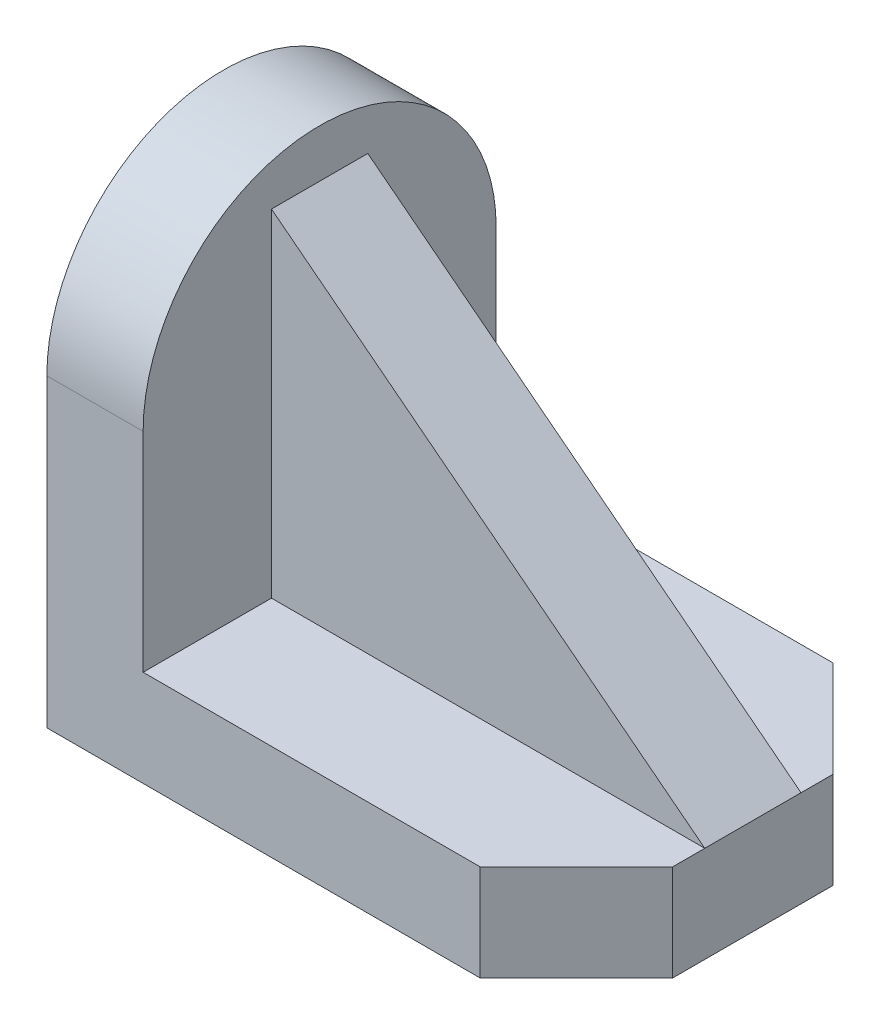
ISO-10303-21;
HEADER;
FILE_DESCRIPTION(('STEP AP214'),'2;1');
FILE_NAME('part.step','',(''),(''),'','','');
FILE_SCHEMA(('AUTOMOTIVE_DESIGN { 1 0 10303 214 1 1 1 1 }'));
ENDSEC;
DATA;
#1=APPLICATION_CONTEXT('core data for automotive mechanical design processes');
#2=APPLICATION_PROTOCOL_DEFINITION('international standard','automotive_design',2000,#1);
#3=PRODUCT_CONTEXT('',#1,'mechanical');
#4=PRODUCT('Part','Part','',(#3));
#5=PRODUCT_RELATED_PRODUCT_CATEGORY('part','',(#4));
#6=PRODUCT_DEFINITION_FORMATION('','',#4);
#7=PRODUCT_DEFINITION_CONTEXT('part definition',#1,'design');
#8=PRODUCT_DEFINITION('design','',#6,#7);
#9=PRODUCT_DEFINITION_SHAPE('','',#8);
#10=(LENGTH_UNIT() NAMED_UNIT(*) SI_UNIT(.MILLI.,.METRE.));
#11=(NAMED_UNIT(*) PLANE_ANGLE_UNIT() SI_UNIT($,.RADIAN.));
#12=(NAMED_UNIT(*) SI_UNIT($,.STERADIAN.) SOLID_ANGLE_UNIT());
#13=UNCERTAINTY_MEASURE_WITH_UNIT(LENGTH_MEASURE(1.E-05),#10,'distance_accuracy_value','');
#14=(GEOMETRIC_REPRESENTATION_CONTEXT(3) GLOBAL_UNCERTAINTY_ASSIGNED_CONTEXT((#13)) GLOBAL_UNIT_ASSIGNED_CONTEXT((#10,
#11,#12)) REPRESENTATION_CONTEXT('',''));
#15=CARTESIAN_POINT('',(0.,0.,0.));
#16=DIRECTION('',(0.,0.,1.));
#17=DIRECTION('',(1.,0.,0.));
#18=AXIS2_PLACEMENT_3D('',#15,#16,#17);
#19=CARTESIAN_POINT('',(0.,12.,0.));
#20=DIRECTION('',(0.,-1.,0.));
#21=DIRECTION('',(0.,0.,-1.));
#22=AXIS2_PLACEMENT_3D('',#19,#20,#21);
#23=PLANE('',#22);
#24=DIRECTION('',(1.,0.,0.));
#25=VECTOR('',#24,1.);
#26=CARTESIAN_POINT('',(33.,12.,-6.));
#27=LINE('',#26,#25);
#28=CARTESIAN_POINT('',(-21.,12.,-6.));
#29=VERTEX_POINT('',#28);
#30=CARTESIAN_POINT('',(33.,12.,-6.));
#31=VERTEX_POINT('',#30);
#32=EDGE_CURVE('E57',#29,#31,#27,.T.);
#33=ORIENTED_EDGE('',*,*,#32,.T.);
#34=DIRECTION('',(0.,0.,-1.));
#35=VECTOR('',#34,1.);
#36=CARTESIAN_POINT('',(33.,12.,22.));
#37=LINE('',#36,#35);
#38=CARTESIAN_POINT('',(33.,12.,-9.99999999999994));
#39=VERTEX_POINT('',#38);
#40=EDGE_CURVE('E161',#31,#39,#37,.T.);
#41=ORIENTED_EDGE('',*,*,#40,.T.);
#42=DIRECTION('',(0.707106781186546,0.,0.707106781186549));
#43=VECTOR('',#42,1.);
#44=CARTESIAN_POINT('',(21.,12.,-22.));
#45=LINE('',#44,#43);
#46=CARTESIAN_POINT('',(21.,12.,-22.));
#47=VERTEX_POINT('',#46);
#48=EDGE_CURVE('E196',#39,#47,#45,.F.);
#49=ORIENTED_EDGE('',*,*,#48,.T.);
#50=DIRECTION('',(-1.,0.,0.));
#51=VECTOR('',#50,1.);
#52=CARTESIAN_POINT('',(-33.,12.,-22.));
#53=LINE('',#52,#51);
#54=CARTESIAN_POINT('',(-21.,12.,-22.));
#55=VERTEX_POINT('',#54);
#56=EDGE_CURVE('E160',#47,#55,#53,.T.);
#57=ORIENTED_EDGE('',*,*,#56,.T.);
#58=DIRECTION('',(0.,0.,1.));
#59=VECTOR('',#58,1.);
#60=CARTESIAN_POINT('',(-21.,12.,-22.));
#61=LINE('',#60,#59);
#62=EDGE_CURVE('E149',#55,#29,#61,.T.);
#63=ORIENTED_EDGE('',*,*,#62,.T.);
#64=EDGE_LOOP('',(#33,#41,#49,#57,#63));
#65=FACE_BOUND('',#64,.T.);
#66=ADVANCED_FACE('F41',(#65),#23,.F.);
#67=CARTESIAN_POINT('',(-21.,38.,0.));
#68=DIRECTION('',(-1.,0.,0.));
#69=DIRECTION('',(0.,0.,1.));
#70=AXIS2_PLACEMENT_3D('',#67,#68,#69);
#71=CYLINDRICAL_SURFACE('',#70,22.);
#72=DIRECTION('',(1.,0.,0.));
#73=VECTOR('',#72,1.);
#74=CARTESIAN_POINT('',(-21.,38.,22.));
#75=LINE('',#74,#73);
#76=CARTESIAN_POINT('',(-21.,38.,22.));
#77=VERTEX_POINT('',#76);
#78=CARTESIAN_POINT('',(-33.,38.,22.));
#79=VERTEX_POINT('',#78);
#80=EDGE_CURVE('E201',#77,#79,#75,.F.);
#81=ORIENTED_EDGE('',*,*,#80,.F.);
#82=CARTESIAN_POINT('',(-21.,38.,0.));
#83=DIRECTION('',(1.,0.,0.));
#84=DIRECTION('',(0.,0.,-1.));
#85=AXIS2_PLACEMENT_3D('',#82,#83,#84);
#86=CIRCLE('',#85,22.);
#87=CARTESIAN_POINT('',(-21.,38.,-22.));
#88=VERTEX_POINT('',#87);
#89=EDGE_CURVE('E50',#88,#77,#86,.T.);
#90=ORIENTED_EDGE('',*,*,#89,.F.);
#91=DIRECTION('',(1.,0.,0.));
#92=VECTOR('',#91,1.);
#93=CARTESIAN_POINT('',(-21.,38.,-22.));
#94=LINE('',#93,#92);
#95=CARTESIAN_POINT('',(-33.,38.,-22.));
#96=VERTEX_POINT('',#95);
#97=EDGE_CURVE('E204',#96,#88,#94,.T.);
#98=ORIENTED_EDGE('',*,*,#97,.F.);
#99=CARTESIAN_POINT('',(-33.,38.,0.));
#100=DIRECTION('',(1.,0.,0.));
#101=DIRECTION('',(0.,0.,-1.));
#102=AXIS2_PLACEMENT_3D('',#99,#100,#101);
#103=CIRCLE('',#102,22.);
#104=EDGE_CURVE('E11',#79,#96,#103,.F.);
#105=ORIENTED_EDGE('',*,*,#104,.F.);
#106=EDGE_LOOP('',(#81,#90,#98,#105));
#107=FACE_BOUND('',#106,.T.);
#108=ADVANCED_FACE('F44',(#107),#71,.T.);
#109=CARTESIAN_POINT('',(33.,12.,22.));
#110=DIRECTION('',(-1.,0.,0.));
#111=DIRECTION('',(0.,0.,1.));
#112=AXIS2_PLACEMENT_3D('',#109,#110,#111);
#113=PLANE('',#112);
#114=DIRECTION('',(0.,0.,-1.));
#115=VECTOR('',#114,1.);
#116=CARTESIAN_POINT('',(33.,0.,22.));
#117=LINE('',#116,#115);
#118=CARTESIAN_POINT('',(33.,0.,9.99999999999999));
#119=VERTEX_POINT('',#118);
#120=CARTESIAN_POINT('',(33.,0.,-9.99999999999994));
#121=VERTEX_POINT('',#120);
#122=EDGE_CURVE('E158',#119,#121,#117,.T.);
#123=ORIENTED_EDGE('',*,*,#122,.T.);
#124=DIRECTION('',(0.,1.,0.));
#125=VECTOR('',#124,1.);
#126=CARTESIAN_POINT('',(33.,12.,-9.99999999999994));
#127=LINE('',#126,#125);
#128=EDGE_CURVE('E191',#121,#39,#127,.T.);
#129=ORIENTED_EDGE('',*,*,#128,.T.);
#130=ORIENTED_EDGE('',*,*,#40,.F.);
#131=DIRECTION('',(0.,0.,-1.));
#132=VECTOR('',#131,1.);
#133=CARTESIAN_POINT('',(33.,12.,6.));
#134=LINE('',#133,#132);
#135=CARTESIAN_POINT('',(33.,12.,6.));
#136=VERTEX_POINT('',#135);
#137=EDGE_CURVE('E153',#136,#31,#134,.T.);
#138=ORIENTED_EDGE('',*,*,#137,.F.);
#139=CARTESIAN_POINT('',(33.,12.,9.99999999999999));
#140=VERTEX_POINT('',#139);
#141=EDGE_CURVE('E143',#140,#136,#37,.T.);
#142=ORIENTED_EDGE('',*,*,#141,.F.);
#143=DIRECTION('',(0.,-1.,0.));
#144=VECTOR('',#143,1.);
#145=CARTESIAN_POINT('',(33.,12.,9.99999999999999));
#146=LINE('',#145,#144);
#147=EDGE_CURVE('E188',#140,#119,#146,.T.);
#148=ORIENTED_EDGE('',*,*,#147,.T.);
#149=EDGE_LOOP('',(#123,#129,#130,#138,#142,#148));
#150=FACE_BOUND('',#149,.T.);
#151=ADVANCED_FACE('F216',(#150),#113,.F.);
#152=CARTESIAN_POINT('',(-33.,12.,-22.));
#153=DIRECTION('',(0.,0.,1.));
#154=DIRECTION('',(1.,0.,0.));
#155=AXIS2_PLACEMENT_3D('',#152,#153,#154);
#156=PLANE('',#155);
#157=DIRECTION('',(0.,-1.,0.));
#158=VECTOR('',#157,1.);
#159=CARTESIAN_POINT('',(-33.,12.,-22.));
#160=LINE('',#159,#158);
#161=CARTESIAN_POINT('',(-33.,0.,-22.));
#162=VERTEX_POINT('',#161);
#163=EDGE_CURVE('E179',#96,#162,#160,.T.);
#164=ORIENTED_EDGE('',*,*,#163,.F.);
#165=ORIENTED_EDGE('',*,*,#97,.T.);
#166=DIRECTION('',(0.,-1.,0.));
#167=VECTOR('',#166,1.);
#168=CARTESIAN_POINT('',(-21.,12.,-22.));
#169=LINE('',#168,#167);
#170=EDGE_CURVE('E150',#88,#55,#169,.T.);
#171=ORIENTED_EDGE('',*,*,#170,.T.);
#172=ORIENTED_EDGE('',*,*,#56,.F.);
#173=DIRECTION('',(0.,-1.,0.));
#174=VECTOR('',#173,1.);
#175=CARTESIAN_POINT('',(21.,12.,-22.));
#176=LINE('',#175,#174);
#177=CARTESIAN_POINT('',(21.,0.,-22.));
#178=VERTEX_POINT('',#177);
#179=EDGE_CURVE('E181',#47,#178,#176,.T.);
#180=ORIENTED_EDGE('',*,*,#179,.T.);
#181=DIRECTION('',(-1.,0.,0.));
#182=VECTOR('',#181,1.);
#183=CARTESIAN_POINT('',(-33.,0.,-22.));
#184=LINE('',#183,#182);
#185=EDGE_CURVE('E169',#178,#162,#184,.T.);
#186=ORIENTED_EDGE('',*,*,#185,.T.);
#187=EDGE_LOOP('',(#164,#165,#171,#172,#180,#186));
#188=FACE_BOUND('',#187,.T.);
#189=ADVANCED_FACE('F229',(#188),#156,.F.);
#190=CARTESIAN_POINT('',(-33.,12.,22.));
#191=DIRECTION('',(1.,0.,0.));
#192=DIRECTION('',(0.,0.,-1.));
#193=AXIS2_PLACEMENT_3D('',#190,#191,#192);
#194=PLANE('',#193);
#195=DIRECTION('',(0.,-1.,0.));
#196=VECTOR('',#195,1.);
#197=CARTESIAN_POINT('',(-33.,12.,22.));
#198=LINE('',#197,#196);
#199=CARTESIAN_POINT('',(-33.,0.,22.));
#200=VERTEX_POINT('',#199);
#201=EDGE_CURVE('E166',#79,#200,#198,.T.);
#202=ORIENTED_EDGE('',*,*,#201,.F.);
#203=ORIENTED_EDGE('',*,*,#104,.T.);
#204=ORIENTED_EDGE('',*,*,#163,.T.);
#205=DIRECTION('',(0.,0.,1.));
#206=VECTOR('',#205,1.);
#207=CARTESIAN_POINT('',(-33.,0.,22.));
#208=LINE('',#207,#206);
#209=EDGE_CURVE('E172',#162,#200,#208,.T.);
#210=ORIENTED_EDGE('',*,*,#209,.T.);
#211=EDGE_LOOP('',(#202,#203,#204,#210));
#212=FACE_BOUND('',#211,.T.);
#213=ADVANCED_FACE('F226',(#212),#194,.F.);
#214=CARTESIAN_POINT('',(-33.,12.,22.));
#215=DIRECTION('',(0.,0.,-1.));
#216=DIRECTION('',(-1.,0.,0.));
#217=AXIS2_PLACEMENT_3D('',#214,#215,#216);
#218=PLANE('',#217);
#219=DIRECTION('',(0.,1.,0.));
#220=VECTOR('',#219,1.);
#221=CARTESIAN_POINT('',(-21.,12.,22.));
#222=LINE('',#221,#220);
#223=CARTESIAN_POINT('',(-21.,12.,22.));
#224=VERTEX_POINT('',#223);
#225=EDGE_CURVE('E147',#224,#77,#222,.T.);
#226=ORIENTED_EDGE('',*,*,#225,.T.);
#227=ORIENTED_EDGE('',*,*,#80,.T.);
#228=ORIENTED_EDGE('',*,*,#201,.T.);
#229=DIRECTION('',(1.,0.,0.));
#230=VECTOR('',#229,1.);
#231=CARTESIAN_POINT('',(-33.,0.,22.));
#232=LINE('',#231,#230);
#233=CARTESIAN_POINT('',(21.,0.,22.));
#234=VERTEX_POINT('',#233);
#235=EDGE_CURVE('E175',#200,#234,#232,.T.);
#236=ORIENTED_EDGE('',*,*,#235,.T.);
#237=DIRECTION('',(0.,1.,0.));
#238=VECTOR('',#237,1.);
#239=CARTESIAN_POINT('',(21.,12.,22.));
#240=LINE('',#239,#238);
#241=CARTESIAN_POINT('',(21.,12.,22.));
#242=VERTEX_POINT('',#241);
#243=EDGE_CURVE('E198',#234,#242,#240,.T.);
#244=ORIENTED_EDGE('',*,*,#243,.T.);
#245=DIRECTION('',(1.,0.,0.));
#246=VECTOR('',#245,1.);
#247=CARTESIAN_POINT('',(-33.,12.,22.));
#248=LINE('',#247,#246);
#249=EDGE_CURVE('E164',#224,#242,#248,.T.);
#250=ORIENTED_EDGE('',*,*,#249,.F.);
#251=EDGE_LOOP('',(#226,#227,#228,#236,#244,#250));
#252=FACE_BOUND('',#251,.T.);
#253=ADVANCED_FACE('F209',(#252),#218,.F.);
#254=ORIENTED_EDGE('',*,*,#141,.T.);
#255=DIRECTION('',(1.,0.,0.));
#256=VECTOR('',#255,1.);
#257=CARTESIAN_POINT('',(33.,12.,6.));
#258=LINE('',#257,#256);
#259=CARTESIAN_POINT('',(-21.,12.,6.));
#260=VERTEX_POINT('',#259);
#261=EDGE_CURVE('E128',#260,#136,#258,.T.);
#262=ORIENTED_EDGE('',*,*,#261,.F.);
#263=EDGE_CURVE('E140',#260,#224,#61,.T.);
#264=ORIENTED_EDGE('',*,*,#263,.T.);
#265=ORIENTED_EDGE('',*,*,#249,.T.);
#266=DIRECTION('',(-0.707106781186549,0.,0.707106781186546));
#267=VECTOR('',#266,1.);
#268=CARTESIAN_POINT('',(33.,12.,9.99999999999999));
#269=LINE('',#268,#267);
#270=EDGE_CURVE('E194',#242,#140,#269,.F.);
#271=ORIENTED_EDGE('',*,*,#270,.T.);
#272=EDGE_LOOP('',(#254,#262,#264,#265,#271));
#273=FACE_BOUND('',#272,.T.);
#274=ADVANCED_FACE('F139',(#273),#23,.F.);
#275=CARTESIAN_POINT('',(0.,0.,0.));
#276=DIRECTION('',(0.,-1.,0.));
#277=DIRECTION('',(0.,0.,-1.));
#278=AXIS2_PLACEMENT_3D('',#275,#276,#277);
#279=PLANE('',#278);
#280=ORIENTED_EDGE('',*,*,#185,.F.);
#281=DIRECTION('',(-0.707106781186546,0.,-0.707106781186549));
#282=VECTOR('',#281,1.);
#283=CARTESIAN_POINT('',(21.5,0.,-21.5));
#284=LINE('',#283,#282);
#285=EDGE_CURVE('E186',#178,#121,#284,.F.);
#286=ORIENTED_EDGE('',*,*,#285,.T.);
#287=ORIENTED_EDGE('',*,*,#122,.F.);
#288=DIRECTION('',(0.707106781186549,0.,-0.707106781186546));
#289=VECTOR('',#288,1.);
#290=CARTESIAN_POINT('',(21.4999999999999,0.,21.5));
#291=LINE('',#290,#289);
#292=EDGE_CURVE('E184',#119,#234,#291,.F.);
#293=ORIENTED_EDGE('',*,*,#292,.T.);
#294=ORIENTED_EDGE('',*,*,#235,.F.);
#295=ORIENTED_EDGE('',*,*,#209,.F.);
#296=EDGE_LOOP('',(#280,#286,#287,#293,#294,#295));
#297=FACE_BOUND('',#296,.T.);
#298=ADVANCED_FACE('F223',(#297),#279,.T.);
#299=CARTESIAN_POINT('',(21.,12.,-22.));
#300=DIRECTION('',(-0.707106781186549,0.,0.707106781186546));
#301=DIRECTION('',(0.,-1.,0.));
#302=AXIS2_PLACEMENT_3D('',#299,#300,#301);
#303=PLANE('',#302);
#304=ORIENTED_EDGE('',*,*,#48,.F.);
#305=ORIENTED_EDGE('',*,*,#128,.F.);
#306=ORIENTED_EDGE('',*,*,#285,.F.);
#307=ORIENTED_EDGE('',*,*,#179,.F.);
#308=EDGE_LOOP('',(#304,#305,#306,#307));
#309=FACE_BOUND('',#308,.T.);
#310=ADVANCED_FACE('F234',(#309),#303,.F.);
#311=CARTESIAN_POINT('',(33.,12.,9.99999999999999));
#312=DIRECTION('',(-0.707106781186546,0.,-0.707106781186549));
#313=DIRECTION('',(0.,-1.,0.));
#314=AXIS2_PLACEMENT_3D('',#311,#312,#313);
#315=PLANE('',#314);
#316=ORIENTED_EDGE('',*,*,#270,.F.);
#317=ORIENTED_EDGE('',*,*,#243,.F.);
#318=ORIENTED_EDGE('',*,*,#292,.F.);
#319=ORIENTED_EDGE('',*,*,#147,.F.);
#320=EDGE_LOOP('',(#316,#317,#318,#319));
#321=FACE_BOUND('',#320,.T.);
#322=ADVANCED_FACE('F219',(#321),#315,.F.);
#323=CARTESIAN_POINT('',(-21.,0.,0.));
#324=DIRECTION('',(1.,0.,0.));
#325=DIRECTION('',(0.,0.,-1.));
#326=AXIS2_PLACEMENT_3D('',#323,#324,#325);
#327=PLANE('',#326);
#328=DIRECTION('',(0.,-1.,0.));
#329=VECTOR('',#328,1.);
#330=CARTESIAN_POINT('',(-21.,12.,6.));
#331=LINE('',#330,#329);
#332=CARTESIAN_POINT('',(-21.,54.,6.));
#333=VERTEX_POINT('',#332);
#334=EDGE_CURVE('E125',#333,#260,#331,.T.);
#335=ORIENTED_EDGE('',*,*,#334,.F.);
#336=DIRECTION('',(0.,0.,-1.));
#337=VECTOR('',#336,1.);
#338=CARTESIAN_POINT('',(-21.,54.,6.));
#339=LINE('',#338,#337);
#340=CARTESIAN_POINT('',(-21.,54.,-6.));
#341=VERTEX_POINT('',#340);
#342=EDGE_CURVE('E243',#333,#341,#339,.T.);
#343=ORIENTED_EDGE('',*,*,#342,.T.);
#344=DIRECTION('',(0.,-1.,0.));
#345=VECTOR('',#344,1.);
#346=CARTESIAN_POINT('',(-21.,12.,-6.));
#347=LINE('',#346,#345);
#348=EDGE_CURVE('E237',#341,#29,#347,.T.);
#349=ORIENTED_EDGE('',*,*,#348,.T.);
#350=ORIENTED_EDGE('',*,*,#62,.F.);
#351=ORIENTED_EDGE('',*,*,#170,.F.);
#352=ORIENTED_EDGE('',*,*,#89,.T.);
#353=ORIENTED_EDGE('',*,*,#225,.F.);
#354=ORIENTED_EDGE('',*,*,#263,.F.);
#355=EDGE_LOOP('',(#335,#343,#349,#350,#351,#352,#353,#354));
#356=FACE_BOUND('',#355,.T.);
#357=ADVANCED_FACE('F145',(#356),#327,.T.);
#358=CARTESIAN_POINT('',(-21.,54.,6.));
#359=DIRECTION('',(-0.613940613514921,-0.789352217376326,0.));
#360=DIRECTION('',(0.789352217376326,-0.613940613514921,0.));
#361=AXIS2_PLACEMENT_3D('',#358,#359,#360);
#362=PLANE('',#361);
#363=DIRECTION('',(-0.789352217376326,0.61394061351492,0.));
#364=VECTOR('',#363,1.);
#365=CARTESIAN_POINT('',(-21.,54.,-6.));
#366=LINE('',#365,#364);
#367=EDGE_CURVE('E135',#31,#341,#366,.T.);
#368=ORIENTED_EDGE('',*,*,#367,.T.);
#369=ORIENTED_EDGE('',*,*,#342,.F.);
#370=DIRECTION('',(-0.789352217376326,0.61394061351492,0.));
#371=VECTOR('',#370,1.);
#372=CARTESIAN_POINT('',(-21.,54.,6.));
#373=LINE('',#372,#371);
#374=EDGE_CURVE('E130',#136,#333,#373,.T.);
#375=ORIENTED_EDGE('',*,*,#374,.F.);
#376=ORIENTED_EDGE('',*,*,#137,.T.);
#377=EDGE_LOOP('',(#368,#369,#375,#376));
#378=FACE_BOUND('',#377,.T.);
#379=ADVANCED_FACE('F245',(#378),#362,.F.);
#380=CARTESIAN_POINT('',(0.,0.,6.));
#381=DIRECTION('',(0.,0.,1.));
#382=DIRECTION('',(1.,0.,0.));
#383=AXIS2_PLACEMENT_3D('',#380,#381,#382);
#384=PLANE('',#383);
#385=ORIENTED_EDGE('',*,*,#334,.T.);
#386=ORIENTED_EDGE('',*,*,#261,.T.);
#387=ORIENTED_EDGE('',*,*,#374,.T.);
#388=EDGE_LOOP('',(#385,#386,#387));
#389=FACE_BOUND('',#388,.T.);
#390=ADVANCED_FACE('F127',(#389),#384,.T.);
#391=CARTESIAN_POINT('',(0.,0.,-6.));
#392=DIRECTION('',(0.,0.,1.));
#393=DIRECTION('',(1.,0.,0.));
#394=AXIS2_PLACEMENT_3D('',#391,#392,#393);
#395=PLANE('',#394);
#396=ORIENTED_EDGE('',*,*,#348,.F.);
#397=ORIENTED_EDGE('',*,*,#367,.F.);
#398=ORIENTED_EDGE('',*,*,#32,.F.);
#399=EDGE_LOOP('',(#396,#397,#398));
#400=FACE_BOUND('',#399,.T.);
#401=ADVANCED_FACE('F246',(#400),#395,.F.);
#402=CLOSED_SHELL('',(#66,#108,#151,#189,#213,#253,#274,#298,#310,#322,#357,#379,#390,#401));
#403=MANIFOLD_SOLID_BREP('B2',#402);
#404=ADVANCED_BREP_SHAPE_REPRESENTATION('',(#18,#403),#14);
#405=SHAPE_DEFINITION_REPRESENTATION(#9,#404);
ENDSEC;
END-ISO-10303-21;
